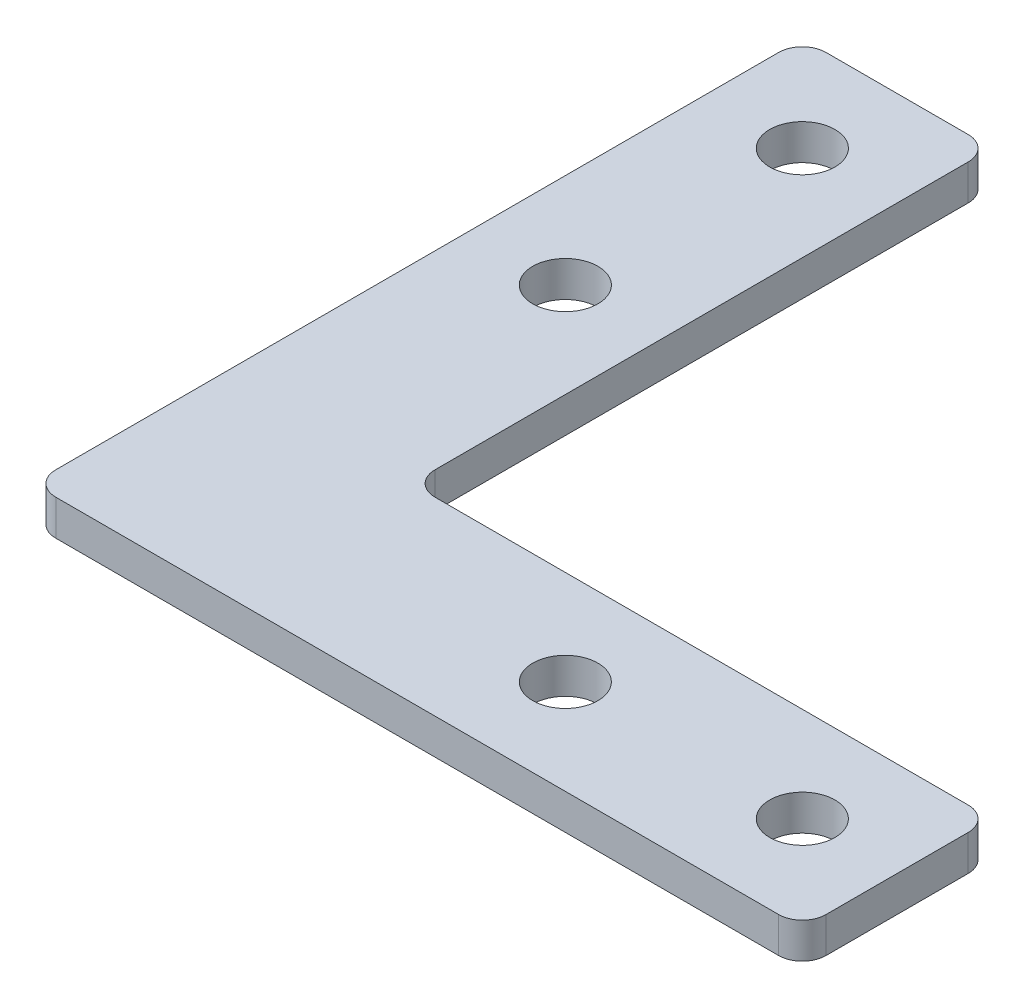
ISO-10303-21;
HEADER;
FILE_DESCRIPTION(('STEP AP214'),'2;1');
FILE_NAME('part.step','',(''),(''),'','','');
FILE_SCHEMA(('AUTOMOTIVE_DESIGN { 1 0 10303 214 1 1 1 1 }'));
ENDSEC;
DATA;
#1=APPLICATION_CONTEXT('core data for automotive mechanical design processes');
#2=APPLICATION_PROTOCOL_DEFINITION('international standard','automotive_design',2000,#1);
#3=PRODUCT_CONTEXT('',#1,'mechanical');
#4=PRODUCT('Part','Part','',(#3));
#5=PRODUCT_RELATED_PRODUCT_CATEGORY('part','',(#4));
#6=PRODUCT_DEFINITION_FORMATION('','',#4);
#7=PRODUCT_DEFINITION_CONTEXT('part definition',#1,'design');
#8=PRODUCT_DEFINITION('design','',#6,#7);
#9=PRODUCT_DEFINITION_SHAPE('','',#8);
#10=(LENGTH_UNIT() NAMED_UNIT(*) SI_UNIT(.MILLI.,.METRE.));
#11=(NAMED_UNIT(*) PLANE_ANGLE_UNIT() SI_UNIT($,.RADIAN.));
#12=(NAMED_UNIT(*) SI_UNIT($,.STERADIAN.) SOLID_ANGLE_UNIT());
#13=UNCERTAINTY_MEASURE_WITH_UNIT(LENGTH_MEASURE(1.E-05),#10,'distance_accuracy_value','');
#14=(GEOMETRIC_REPRESENTATION_CONTEXT(3) GLOBAL_UNCERTAINTY_ASSIGNED_CONTEXT((#13)) GLOBAL_UNIT_ASSIGNED_CONTEXT((#10,
#11,#12)) REPRESENTATION_CONTEXT('',''));
#15=CARTESIAN_POINT('',(0.,0.,0.));
#16=DIRECTION('',(0.,0.,1.));
#17=DIRECTION('',(1.,0.,0.));
#18=AXIS2_PLACEMENT_3D('',#15,#16,#17);
#19=CARTESIAN_POINT('',(-34.3186376674026,3.,20.5779741957317));
#20=DIRECTION('',(0.,1.,0.));
#21=DIRECTION('',(0.,0.,1.));
#22=AXIS2_PLACEMENT_3D('',#19,#20,#21);
#23=PLANE('',#22);
#24=CARTESIAN_POINT('',(-28.3186376674026,3.,-34.4220258042683));
#25=DIRECTION('',(0.,1.,0.));
#26=DIRECTION('',(0.,0.,-1.));
#27=AXIS2_PLACEMENT_3D('',#24,#25,#26);
#28=CIRCLE('',#27,2.74999999999999);
#29=CARTESIAN_POINT('',(-28.3186376674026,3.,-37.1720258042683));
#30=VERTEX_POINT('',#29);
#31=EDGE_CURVE('E338',#30,#30,#28,.T.);
#32=ORIENTED_EDGE('',*,*,#31,.F.);
#33=EDGE_LOOP('',(#32));
#34=FACE_BOUND('',#33,.T.);
#35=CARTESIAN_POINT('',(20.6813623325974,3.,14.5779741957317));
#36=DIRECTION('',(0.,1.,0.));
#37=DIRECTION('',(0.,0.,1.));
#38=AXIS2_PLACEMENT_3D('',#35,#36,#37);
#39=CIRCLE('',#38,2.75);
#40=CARTESIAN_POINT('',(20.6813623325974,3.,17.3279741957317));
#41=VERTEX_POINT('',#40);
#42=EDGE_CURVE('E176',#41,#41,#39,.T.);
#43=ORIENTED_EDGE('',*,*,#42,.F.);
#44=EDGE_LOOP('',(#43));
#45=FACE_BOUND('',#44,.T.);
#46=CARTESIAN_POINT('',(-34.3186376674026,3.,20.5779741957317));
#47=DIRECTION('',(0.,1.,0.));
#48=DIRECTION('',(0.,0.,1.));
#49=AXIS2_PLACEMENT_3D('',#46,#47,#48);
#50=CIRCLE('',#49,2.);
#51=CARTESIAN_POINT('',(-36.3186376674026,3.,20.5779741957316));
#52=VERTEX_POINT('',#51);
#53=CARTESIAN_POINT('',(-34.3186376674026,3.,22.5779741957317));
#54=VERTEX_POINT('',#53);
#55=EDGE_CURVE('E206',#52,#54,#50,.T.);
#56=ORIENTED_EDGE('',*,*,#55,.T.);
#57=DIRECTION('',(1.,0.,0.));
#58=VECTOR('',#57,1.);
#59=CARTESIAN_POINT('',(-34.3186376674026,3.,22.5779741957317));
#60=LINE('',#59,#58);
#61=CARTESIAN_POINT('',(26.6813623325974,3.,22.5779741957317));
#62=VERTEX_POINT('',#61);
#63=EDGE_CURVE('E118',#54,#62,#60,.T.);
#64=ORIENTED_EDGE('',*,*,#63,.T.);
#65=CARTESIAN_POINT('',(26.6813623325974,3.,20.5779741957317));
#66=DIRECTION('',(0.,1.,0.));
#67=DIRECTION('',(0.,0.,1.));
#68=AXIS2_PLACEMENT_3D('',#65,#66,#67);
#69=CIRCLE('',#68,2.);
#70=CARTESIAN_POINT('',(28.6813623325974,3.,20.5779741957317));
#71=VERTEX_POINT('',#70);
#72=EDGE_CURVE('E243',#62,#71,#69,.T.);
#73=ORIENTED_EDGE('',*,*,#72,.T.);
#74=DIRECTION('',(0.,0.,-1.));
#75=VECTOR('',#74,1.);
#76=CARTESIAN_POINT('',(28.6813623325974,3.,20.5779741957317));
#77=LINE('',#76,#75);
#78=CARTESIAN_POINT('',(28.6813623325974,3.,8.57797419573168));
#79=VERTEX_POINT('',#78);
#80=EDGE_CURVE('E263',#71,#79,#77,.T.);
#81=ORIENTED_EDGE('',*,*,#80,.T.);
#82=CARTESIAN_POINT('',(26.6813623325974,3.,8.57797419573167));
#83=DIRECTION('',(0.,1.,0.));
#84=DIRECTION('',(0.,0.,1.));
#85=AXIS2_PLACEMENT_3D('',#82,#83,#84);
#86=CIRCLE('',#85,2.);
#87=CARTESIAN_POINT('',(26.6813623325974,3.,6.57797419573167));
#88=VERTEX_POINT('',#87);
#89=EDGE_CURVE('E259',#79,#88,#86,.T.);
#90=ORIENTED_EDGE('',*,*,#89,.T.);
#91=DIRECTION('',(-1.,0.,0.));
#92=VECTOR('',#91,1.);
#93=CARTESIAN_POINT('',(26.6813623325974,3.,6.57797419573167));
#94=LINE('',#93,#92);
#95=CARTESIAN_POINT('',(-18.3186376674026,3.,6.57797419573167));
#96=VERTEX_POINT('',#95);
#97=EDGE_CURVE('E262',#88,#96,#94,.T.);
#98=ORIENTED_EDGE('',*,*,#97,.T.);
#99=CARTESIAN_POINT('',(-18.3186376674026,3.,4.57797419573167));
#100=DIRECTION('',(0.,-1.,0.));
#101=DIRECTION('',(0.,0.,-1.));
#102=AXIS2_PLACEMENT_3D('',#99,#100,#101);
#103=CIRCLE('',#102,2.);
#104=CARTESIAN_POINT('',(-20.3186376674026,3.,4.57797419573166));
#105=VERTEX_POINT('',#104);
#106=EDGE_CURVE('E267',#96,#105,#103,.T.);
#107=ORIENTED_EDGE('',*,*,#106,.T.);
#108=DIRECTION('',(0.,0.,-1.));
#109=VECTOR('',#108,1.);
#110=CARTESIAN_POINT('',(-20.3186376674026,3.,4.57797419573166));
#111=LINE('',#110,#109);
#112=CARTESIAN_POINT('',(-20.3186376674026,3.,-40.4220258042683));
#113=VERTEX_POINT('',#112);
#114=EDGE_CURVE('E274',#105,#113,#111,.T.);
#115=ORIENTED_EDGE('',*,*,#114,.T.);
#116=CARTESIAN_POINT('',(-22.3186376674026,3.,-40.4220258042683));
#117=DIRECTION('',(0.,1.,0.));
#118=DIRECTION('',(0.,0.,1.));
#119=AXIS2_PLACEMENT_3D('',#116,#117,#118);
#120=CIRCLE('',#119,2.);
#121=CARTESIAN_POINT('',(-22.3186376674027,3.,-42.4220258042683));
#122=VERTEX_POINT('',#121);
#123=EDGE_CURVE('E149',#113,#122,#120,.T.);
#124=ORIENTED_EDGE('',*,*,#123,.T.);
#125=DIRECTION('',(-1.,0.,0.));
#126=VECTOR('',#125,1.);
#127=CARTESIAN_POINT('',(-22.3186376674027,3.,-42.4220258042683));
#128=LINE('',#127,#126);
#129=CARTESIAN_POINT('',(-34.3186376674026,3.,-42.4220258042683));
#130=VERTEX_POINT('',#129);
#131=EDGE_CURVE('E143',#122,#130,#128,.T.);
#132=ORIENTED_EDGE('',*,*,#131,.T.);
#133=CARTESIAN_POINT('',(-34.3186376674026,3.,-40.4220258042683));
#134=DIRECTION('',(0.,1.,0.));
#135=DIRECTION('',(0.,0.,-1.));
#136=AXIS2_PLACEMENT_3D('',#133,#134,#135);
#137=CIRCLE('',#136,2.);
#138=CARTESIAN_POINT('',(-36.3186376674026,3.,-40.4220258042683));
#139=VERTEX_POINT('',#138);
#140=EDGE_CURVE('E147',#130,#139,#137,.T.);
#141=ORIENTED_EDGE('',*,*,#140,.T.);
#142=DIRECTION('',(0.,0.,1.));
#143=VECTOR('',#142,1.);
#144=CARTESIAN_POINT('',(-36.3186376674026,3.,-40.4220258042683));
#145=LINE('',#144,#143);
#146=EDGE_CURVE('E63',#139,#52,#145,.T.);
#147=ORIENTED_EDGE('',*,*,#146,.T.);
#148=EDGE_LOOP('',(#56,#64,#73,#81,#90,#98,#107,#115,#124,#132,#141,#147));
#149=FACE_BOUND('',#148,.T.);
#150=CARTESIAN_POINT('',(0.681362332597368,3.,14.5779741957317));
#151=DIRECTION('',(0.,1.,0.));
#152=DIRECTION('',(0.,0.,1.));
#153=AXIS2_PLACEMENT_3D('',#150,#151,#152);
#154=CIRCLE('',#153,2.75);
#155=CARTESIAN_POINT('',(0.681362332597368,3.,17.3279741957317));
#156=VERTEX_POINT('',#155);
#157=EDGE_CURVE('E346',#156,#156,#154,.T.);
#158=ORIENTED_EDGE('',*,*,#157,.F.);
#159=EDGE_LOOP('',(#158));
#160=FACE_BOUND('',#159,.T.);
#161=CARTESIAN_POINT('',(-28.3186376674026,3.,-14.4220258042683));
#162=DIRECTION('',(0.,1.,0.));
#163=DIRECTION('',(0.,0.,-1.));
#164=AXIS2_PLACEMENT_3D('',#161,#162,#163);
#165=CIRCLE('',#164,2.75);
#166=CARTESIAN_POINT('',(-28.3186376674026,3.,-17.1720258042683));
#167=VERTEX_POINT('',#166);
#168=EDGE_CURVE('E327',#167,#167,#165,.T.);
#169=ORIENTED_EDGE('',*,*,#168,.F.);
#170=EDGE_LOOP('',(#169));
#171=FACE_BOUND('',#170,.T.);
#172=ADVANCED_FACE('F45',(#34,#45,#149,#160,#171),#23,.T.);
#173=CARTESIAN_POINT('',(-34.3186376674026,0.,20.5779741957317));
#174=DIRECTION('',(0.,1.,0.));
#175=DIRECTION('',(0.,0.,1.));
#176=AXIS2_PLACEMENT_3D('',#173,#174,#175);
#177=PLANE('',#176);
#178=CARTESIAN_POINT('',(-34.3186376674026,0.,20.5779741957317));
#179=DIRECTION('',(0.,1.,0.));
#180=DIRECTION('',(0.,0.,1.));
#181=AXIS2_PLACEMENT_3D('',#178,#179,#180);
#182=CIRCLE('',#181,2.);
#183=CARTESIAN_POINT('',(-36.3186376674026,0.,20.5779741957316));
#184=VERTEX_POINT('',#183);
#185=CARTESIAN_POINT('',(-34.3186376674026,0.,22.5779741957317));
#186=VERTEX_POINT('',#185);
#187=EDGE_CURVE('E171',#184,#186,#182,.T.);
#188=ORIENTED_EDGE('',*,*,#187,.F.);
#189=DIRECTION('',(0.,0.,1.));
#190=VECTOR('',#189,1.);
#191=CARTESIAN_POINT('',(-36.3186376674026,0.,-40.4220258042683));
#192=LINE('',#191,#190);
#193=CARTESIAN_POINT('',(-36.3186376674026,0.,-40.4220258042683));
#194=VERTEX_POINT('',#193);
#195=EDGE_CURVE('E110',#194,#184,#192,.T.);
#196=ORIENTED_EDGE('',*,*,#195,.F.);
#197=CARTESIAN_POINT('',(-34.3186376674026,0.,-40.4220258042683));
#198=DIRECTION('',(0.,1.,0.));
#199=DIRECTION('',(0.,0.,-1.));
#200=AXIS2_PLACEMENT_3D('',#197,#198,#199);
#201=CIRCLE('',#200,2.);
#202=CARTESIAN_POINT('',(-34.3186376674026,0.,-42.4220258042683));
#203=VERTEX_POINT('',#202);
#204=EDGE_CURVE('E104',#203,#194,#201,.T.);
#205=ORIENTED_EDGE('',*,*,#204,.F.);
#206=DIRECTION('',(-1.,0.,0.));
#207=VECTOR('',#206,1.);
#208=CARTESIAN_POINT('',(-22.3186376674027,0.,-42.4220258042683));
#209=LINE('',#208,#207);
#210=CARTESIAN_POINT('',(-22.3186376674027,0.,-42.4220258042683));
#211=VERTEX_POINT('',#210);
#212=EDGE_CURVE('E158',#211,#203,#209,.T.);
#213=ORIENTED_EDGE('',*,*,#212,.F.);
#214=CARTESIAN_POINT('',(-22.3186376674026,0.,-40.4220258042683));
#215=DIRECTION('',(0.,1.,0.));
#216=DIRECTION('',(0.,0.,1.));
#217=AXIS2_PLACEMENT_3D('',#214,#215,#216);
#218=CIRCLE('',#217,2.);
#219=CARTESIAN_POINT('',(-20.3186376674026,0.,-40.4220258042683));
#220=VERTEX_POINT('',#219);
#221=EDGE_CURVE('E197',#220,#211,#218,.T.);
#222=ORIENTED_EDGE('',*,*,#221,.F.);
#223=DIRECTION('',(0.,0.,-1.));
#224=VECTOR('',#223,1.);
#225=CARTESIAN_POINT('',(-20.3186376674026,0.,4.57797419573166));
#226=LINE('',#225,#224);
#227=CARTESIAN_POINT('',(-20.3186376674026,0.,4.57797419573166));
#228=VERTEX_POINT('',#227);
#229=EDGE_CURVE('E194',#228,#220,#226,.T.);
#230=ORIENTED_EDGE('',*,*,#229,.F.);
#231=CARTESIAN_POINT('',(-18.3186376674026,0.,4.57797419573167));
#232=DIRECTION('',(0.,-1.,0.));
#233=DIRECTION('',(0.,0.,-1.));
#234=AXIS2_PLACEMENT_3D('',#231,#232,#233);
#235=CIRCLE('',#234,2.);
#236=CARTESIAN_POINT('',(-18.3186376674026,0.,6.57797419573167));
#237=VERTEX_POINT('',#236);
#238=EDGE_CURVE('E191',#237,#228,#235,.T.);
#239=ORIENTED_EDGE('',*,*,#238,.F.);
#240=DIRECTION('',(-1.,0.,0.));
#241=VECTOR('',#240,1.);
#242=CARTESIAN_POINT('',(26.6813623325974,0.,6.57797419573167));
#243=LINE('',#242,#241);
#244=CARTESIAN_POINT('',(26.6813623325974,0.,6.57797419573167));
#245=VERTEX_POINT('',#244);
#246=EDGE_CURVE('E188',#245,#237,#243,.T.);
#247=ORIENTED_EDGE('',*,*,#246,.F.);
#248=CARTESIAN_POINT('',(26.6813623325974,0.,8.57797419573167));
#249=DIRECTION('',(0.,1.,0.));
#250=DIRECTION('',(0.,0.,1.));
#251=AXIS2_PLACEMENT_3D('',#248,#249,#250);
#252=CIRCLE('',#251,2.);
#253=CARTESIAN_POINT('',(28.6813623325974,0.,8.57797419573168));
#254=VERTEX_POINT('',#253);
#255=EDGE_CURVE('E185',#254,#245,#252,.T.);
#256=ORIENTED_EDGE('',*,*,#255,.F.);
#257=DIRECTION('',(0.,0.,-1.));
#258=VECTOR('',#257,1.);
#259=CARTESIAN_POINT('',(28.6813623325974,0.,20.5779741957317));
#260=LINE('',#259,#258);
#261=CARTESIAN_POINT('',(28.6813623325974,0.,20.5779741957317));
#262=VERTEX_POINT('',#261);
#263=EDGE_CURVE('E182',#262,#254,#260,.T.);
#264=ORIENTED_EDGE('',*,*,#263,.F.);
#265=CARTESIAN_POINT('',(26.6813623325974,0.,20.5779741957317));
#266=DIRECTION('',(0.,1.,0.));
#267=DIRECTION('',(0.,0.,1.));
#268=AXIS2_PLACEMENT_3D('',#265,#266,#267);
#269=CIRCLE('',#268,2.);
#270=CARTESIAN_POINT('',(26.6813623325974,0.,22.5779741957317));
#271=VERTEX_POINT('',#270);
#272=EDGE_CURVE('E179',#271,#262,#269,.T.);
#273=ORIENTED_EDGE('',*,*,#272,.F.);
#274=DIRECTION('',(1.,0.,0.));
#275=VECTOR('',#274,1.);
#276=CARTESIAN_POINT('',(-34.3186376674026,0.,22.5779741957317));
#277=LINE('',#276,#275);
#278=EDGE_CURVE('E175',#186,#271,#277,.T.);
#279=ORIENTED_EDGE('',*,*,#278,.F.);
#280=EDGE_LOOP('',(#188,#196,#205,#213,#222,#230,#239,#247,#256,#264,#273,#279));
#281=FACE_BOUND('',#280,.T.);
#282=CARTESIAN_POINT('',(20.6813623325974,0.,14.5779741957317));
#283=DIRECTION('',(0.,1.,0.));
#284=DIRECTION('',(0.,0.,1.));
#285=AXIS2_PLACEMENT_3D('',#282,#283,#284);
#286=CIRCLE('',#285,2.75);
#287=CARTESIAN_POINT('',(20.6813623325974,0.,17.3279741957317));
#288=VERTEX_POINT('',#287);
#289=EDGE_CURVE('E350',#288,#288,#286,.T.);
#290=ORIENTED_EDGE('',*,*,#289,.T.);
#291=EDGE_LOOP('',(#290));
#292=FACE_BOUND('',#291,.T.);
#293=CARTESIAN_POINT('',(0.681362332597368,0.,14.5779741957317));
#294=DIRECTION('',(0.,1.,0.));
#295=DIRECTION('',(0.,0.,1.));
#296=AXIS2_PLACEMENT_3D('',#293,#294,#295);
#297=CIRCLE('',#296,2.75);
#298=CARTESIAN_POINT('',(0.681362332597368,0.,17.3279741957317));
#299=VERTEX_POINT('',#298);
#300=EDGE_CURVE('E342',#299,#299,#297,.T.);
#301=ORIENTED_EDGE('',*,*,#300,.T.);
#302=EDGE_LOOP('',(#301));
#303=FACE_BOUND('',#302,.T.);
#304=CARTESIAN_POINT('',(-28.3186376674026,0.,-34.4220258042683));
#305=DIRECTION('',(0.,1.,0.));
#306=DIRECTION('',(0.,0.,-1.));
#307=AXIS2_PLACEMENT_3D('',#304,#305,#306);
#308=CIRCLE('',#307,2.74999999999999);
#309=CARTESIAN_POINT('',(-28.3186376674026,0.,-37.1720258042683));
#310=VERTEX_POINT('',#309);
#311=EDGE_CURVE('E335',#310,#310,#308,.T.);
#312=ORIENTED_EDGE('',*,*,#311,.T.);
#313=EDGE_LOOP('',(#312));
#314=FACE_BOUND('',#313,.T.);
#315=CARTESIAN_POINT('',(-28.3186376674026,0.,-14.4220258042683));
#316=DIRECTION('',(0.,1.,0.));
#317=DIRECTION('',(0.,0.,-1.));
#318=AXIS2_PLACEMENT_3D('',#315,#316,#317);
#319=CIRCLE('',#318,2.75);
#320=CARTESIAN_POINT('',(-28.3186376674026,0.,-17.1720258042683));
#321=VERTEX_POINT('',#320);
#322=EDGE_CURVE('E330',#321,#321,#319,.T.);
#323=ORIENTED_EDGE('',*,*,#322,.T.);
#324=EDGE_LOOP('',(#323));
#325=FACE_BOUND('',#324,.T.);
#326=ADVANCED_FACE('F247',(#281,#292,#303,#314,#325),#177,.F.);
#327=CARTESIAN_POINT('',(-34.3186376674026,3.,20.5779741957317));
#328=DIRECTION('',(0.,-1.,0.));
#329=DIRECTION('',(0.,0.,-1.));
#330=AXIS2_PLACEMENT_3D('',#327,#328,#329);
#331=CYLINDRICAL_SURFACE('',#330,2.);
#332=ORIENTED_EDGE('',*,*,#187,.T.);
#333=DIRECTION('',(0.,-1.,0.));
#334=VECTOR('',#333,1.);
#335=CARTESIAN_POINT('',(-34.3186376674026,3.,22.5779741957317));
#336=LINE('',#335,#334);
#337=EDGE_CURVE('E11',#54,#186,#336,.T.);
#338=ORIENTED_EDGE('',*,*,#337,.F.);
#339=ORIENTED_EDGE('',*,*,#55,.F.);
#340=DIRECTION('',(0.,-1.,0.));
#341=VECTOR('',#340,1.);
#342=CARTESIAN_POINT('',(-36.3186376674026,3.,20.5779741957316));
#343=LINE('',#342,#341);
#344=EDGE_CURVE('E167',#52,#184,#343,.T.);
#345=ORIENTED_EDGE('',*,*,#344,.T.);
#346=EDGE_LOOP('',(#332,#338,#339,#345));
#347=FACE_BOUND('',#346,.T.);
#348=ADVANCED_FACE('F47',(#347),#331,.T.);
#349=CARTESIAN_POINT('',(-34.3186376674026,3.,22.5779741957317));
#350=DIRECTION('',(0.,0.,-1.));
#351=DIRECTION('',(-1.,0.,0.));
#352=AXIS2_PLACEMENT_3D('',#349,#350,#351);
#353=PLANE('',#352);
#354=ORIENTED_EDGE('',*,*,#278,.T.);
#355=DIRECTION('',(0.,-1.,0.));
#356=VECTOR('',#355,1.);
#357=CARTESIAN_POINT('',(26.6813623325974,3.,22.5779741957317));
#358=LINE('',#357,#356);
#359=EDGE_CURVE('E55',#62,#271,#358,.T.);
#360=ORIENTED_EDGE('',*,*,#359,.F.);
#361=ORIENTED_EDGE('',*,*,#63,.F.);
#362=ORIENTED_EDGE('',*,*,#337,.T.);
#363=EDGE_LOOP('',(#354,#360,#361,#362));
#364=FACE_BOUND('',#363,.T.);
#365=ADVANCED_FACE('F470',(#364),#353,.F.);
#366=CARTESIAN_POINT('',(26.6813623325974,3.,20.5779741957317));
#367=DIRECTION('',(0.,-1.,0.));
#368=DIRECTION('',(0.,0.,-1.));
#369=AXIS2_PLACEMENT_3D('',#366,#367,#368);
#370=CYLINDRICAL_SURFACE('',#369,2.);
#371=ORIENTED_EDGE('',*,*,#272,.T.);
#372=DIRECTION('',(0.,-1.,0.));
#373=VECTOR('',#372,1.);
#374=CARTESIAN_POINT('',(28.6813623325974,3.,20.5779741957317));
#375=LINE('',#374,#373);
#376=EDGE_CURVE('E233',#71,#262,#375,.T.);
#377=ORIENTED_EDGE('',*,*,#376,.F.);
#378=ORIENTED_EDGE('',*,*,#72,.F.);
#379=ORIENTED_EDGE('',*,*,#359,.T.);
#380=EDGE_LOOP('',(#371,#377,#378,#379));
#381=FACE_BOUND('',#380,.T.);
#382=ADVANCED_FACE('F241',(#381),#370,.T.);
#383=CARTESIAN_POINT('',(28.6813623325974,3.,20.5779741957317));
#384=DIRECTION('',(-1.,0.,0.));
#385=DIRECTION('',(0.,0.,1.));
#386=AXIS2_PLACEMENT_3D('',#383,#384,#385);
#387=PLANE('',#386);
#388=ORIENTED_EDGE('',*,*,#263,.T.);
#389=DIRECTION('',(0.,-1.,0.));
#390=VECTOR('',#389,1.);
#391=CARTESIAN_POINT('',(28.6813623325974,3.,8.57797419573168));
#392=LINE('',#391,#390);
#393=EDGE_CURVE('E229',#79,#254,#392,.T.);
#394=ORIENTED_EDGE('',*,*,#393,.F.);
#395=ORIENTED_EDGE('',*,*,#80,.F.);
#396=ORIENTED_EDGE('',*,*,#376,.T.);
#397=EDGE_LOOP('',(#388,#394,#395,#396));
#398=FACE_BOUND('',#397,.T.);
#399=ADVANCED_FACE('F253',(#398),#387,.F.);
#400=CARTESIAN_POINT('',(26.6813623325974,3.,8.57797419573167));
#401=DIRECTION('',(0.,-1.,0.));
#402=DIRECTION('',(0.,0.,-1.));
#403=AXIS2_PLACEMENT_3D('',#400,#401,#402);
#404=CYLINDRICAL_SURFACE('',#403,2.);
#405=ORIENTED_EDGE('',*,*,#255,.T.);
#406=DIRECTION('',(0.,-1.,0.));
#407=VECTOR('',#406,1.);
#408=CARTESIAN_POINT('',(26.6813623325974,3.,6.57797419573167));
#409=LINE('',#408,#407);
#410=EDGE_CURVE('E225',#88,#245,#409,.T.);
#411=ORIENTED_EDGE('',*,*,#410,.F.);
#412=ORIENTED_EDGE('',*,*,#89,.F.);
#413=ORIENTED_EDGE('',*,*,#393,.T.);
#414=EDGE_LOOP('',(#405,#411,#412,#413));
#415=FACE_BOUND('',#414,.T.);
#416=ADVANCED_FACE('F257',(#415),#404,.T.);
#417=CARTESIAN_POINT('',(26.6813623325974,3.,6.57797419573167));
#418=DIRECTION('',(0.,0.,1.));
#419=DIRECTION('',(1.,0.,0.));
#420=AXIS2_PLACEMENT_3D('',#417,#418,#419);
#421=PLANE('',#420);
#422=ORIENTED_EDGE('',*,*,#246,.T.);
#423=DIRECTION('',(0.,-1.,0.));
#424=VECTOR('',#423,1.);
#425=CARTESIAN_POINT('',(-18.3186376674026,3.,6.57797419573167));
#426=LINE('',#425,#424);
#427=EDGE_CURVE('E221',#96,#237,#426,.T.);
#428=ORIENTED_EDGE('',*,*,#427,.F.);
#429=ORIENTED_EDGE('',*,*,#97,.F.);
#430=ORIENTED_EDGE('',*,*,#410,.T.);
#431=EDGE_LOOP('',(#422,#428,#429,#430));
#432=FACE_BOUND('',#431,.T.);
#433=ADVANCED_FACE('F435',(#432),#421,.F.);
#434=CARTESIAN_POINT('',(-18.3186376674026,3.,4.57797419573167));
#435=DIRECTION('',(0.,-1.,0.));
#436=DIRECTION('',(0.,0.,-1.));
#437=AXIS2_PLACEMENT_3D('',#434,#435,#436);
#438=CYLINDRICAL_SURFACE('',#437,2.);
#439=ORIENTED_EDGE('',*,*,#238,.T.);
#440=DIRECTION('',(0.,-1.,0.));
#441=VECTOR('',#440,1.);
#442=CARTESIAN_POINT('',(-20.3186376674026,3.,4.57797419573166));
#443=LINE('',#442,#441);
#444=EDGE_CURVE('E217',#105,#228,#443,.T.);
#445=ORIENTED_EDGE('',*,*,#444,.F.);
#446=ORIENTED_EDGE('',*,*,#106,.F.);
#447=ORIENTED_EDGE('',*,*,#427,.T.);
#448=EDGE_LOOP('',(#439,#445,#446,#447));
#449=FACE_BOUND('',#448,.T.);
#450=ADVANCED_FACE('F426',(#449),#438,.F.);
#451=CARTESIAN_POINT('',(-20.3186376674026,3.,4.57797419573166));
#452=DIRECTION('',(-1.,0.,0.));
#453=DIRECTION('',(0.,0.,1.));
#454=AXIS2_PLACEMENT_3D('',#451,#452,#453);
#455=PLANE('',#454);
#456=ORIENTED_EDGE('',*,*,#229,.T.);
#457=DIRECTION('',(0.,-1.,0.));
#458=VECTOR('',#457,1.);
#459=CARTESIAN_POINT('',(-20.3186376674026,3.,-40.4220258042683));
#460=LINE('',#459,#458);
#461=EDGE_CURVE('E213',#113,#220,#460,.T.);
#462=ORIENTED_EDGE('',*,*,#461,.F.);
#463=ORIENTED_EDGE('',*,*,#114,.F.);
#464=ORIENTED_EDGE('',*,*,#444,.T.);
#465=EDGE_LOOP('',(#456,#462,#463,#464));
#466=FACE_BOUND('',#465,.T.);
#467=ADVANCED_FACE('F282',(#466),#455,.F.);
#468=CARTESIAN_POINT('',(-22.3186376674026,3.,-40.4220258042683));
#469=DIRECTION('',(0.,-1.,0.));
#470=DIRECTION('',(0.,0.,-1.));
#471=AXIS2_PLACEMENT_3D('',#468,#469,#470);
#472=CYLINDRICAL_SURFACE('',#471,2.);
#473=ORIENTED_EDGE('',*,*,#221,.T.);
#474=DIRECTION('',(0.,-1.,0.));
#475=VECTOR('',#474,1.);
#476=CARTESIAN_POINT('',(-22.3186376674027,3.,-42.4220258042683));
#477=LINE('',#476,#475);
#478=EDGE_CURVE('E160',#122,#211,#477,.T.);
#479=ORIENTED_EDGE('',*,*,#478,.F.);
#480=ORIENTED_EDGE('',*,*,#123,.F.);
#481=ORIENTED_EDGE('',*,*,#461,.T.);
#482=EDGE_LOOP('',(#473,#479,#480,#481));
#483=FACE_BOUND('',#482,.T.);
#484=ADVANCED_FACE('F286',(#483),#472,.T.);
#485=CARTESIAN_POINT('',(-22.3186376674027,3.,-42.4220258042683));
#486=DIRECTION('',(0.,0.,1.));
#487=DIRECTION('',(1.,0.,0.));
#488=AXIS2_PLACEMENT_3D('',#485,#486,#487);
#489=PLANE('',#488);
#490=ORIENTED_EDGE('',*,*,#212,.T.);
#491=DIRECTION('',(0.,-1.,0.));
#492=VECTOR('',#491,1.);
#493=CARTESIAN_POINT('',(-34.3186376674026,3.,-42.4220258042683));
#494=LINE('',#493,#492);
#495=EDGE_CURVE('E155',#130,#203,#494,.T.);
#496=ORIENTED_EDGE('',*,*,#495,.F.);
#497=ORIENTED_EDGE('',*,*,#131,.F.);
#498=ORIENTED_EDGE('',*,*,#478,.T.);
#499=EDGE_LOOP('',(#490,#496,#497,#498));
#500=FACE_BOUND('',#499,.T.);
#501=ADVANCED_FACE('F156',(#500),#489,.F.);
#502=CARTESIAN_POINT('',(-34.3186376674026,3.,-40.4220258042683));
#503=DIRECTION('',(0.,-1.,0.));
#504=DIRECTION('',(0.,0.,-1.));
#505=AXIS2_PLACEMENT_3D('',#502,#503,#504);
#506=CYLINDRICAL_SURFACE('',#505,2.);
#507=ORIENTED_EDGE('',*,*,#204,.T.);
#508=DIRECTION('',(0.,-1.,0.));
#509=VECTOR('',#508,1.);
#510=CARTESIAN_POINT('',(-36.3186376674026,3.,-40.4220258042683));
#511=LINE('',#510,#509);
#512=EDGE_CURVE('E161',#139,#194,#511,.T.);
#513=ORIENTED_EDGE('',*,*,#512,.F.);
#514=ORIENTED_EDGE('',*,*,#140,.F.);
#515=ORIENTED_EDGE('',*,*,#495,.T.);
#516=EDGE_LOOP('',(#507,#513,#514,#515));
#517=FACE_BOUND('',#516,.T.);
#518=ADVANCED_FACE('F163',(#517),#506,.T.);
#519=CARTESIAN_POINT('',(-36.3186376674026,3.,-40.4220258042683));
#520=DIRECTION('',(1.,0.,0.));
#521=DIRECTION('',(0.,0.,-1.));
#522=AXIS2_PLACEMENT_3D('',#519,#520,#521);
#523=PLANE('',#522);
#524=ORIENTED_EDGE('',*,*,#195,.T.);
#525=ORIENTED_EDGE('',*,*,#344,.F.);
#526=ORIENTED_EDGE('',*,*,#146,.F.);
#527=ORIENTED_EDGE('',*,*,#512,.T.);
#528=EDGE_LOOP('',(#524,#525,#526,#527));
#529=FACE_BOUND('',#528,.T.);
#530=ADVANCED_FACE('F290',(#529),#523,.F.);
#531=CARTESIAN_POINT('',(20.6813623325974,3.,14.5779741957317));
#532=DIRECTION('',(0.,-1.,0.));
#533=DIRECTION('',(0.,0.,-1.));
#534=AXIS2_PLACEMENT_3D('',#531,#532,#533);
#535=CYLINDRICAL_SURFACE('',#534,2.75);
#536=ORIENTED_EDGE('',*,*,#42,.T.);
#537=EDGE_LOOP('',(#536));
#538=FACE_BOUND('',#537,.T.);
#539=ORIENTED_EDGE('',*,*,#289,.F.);
#540=EDGE_LOOP('',(#539));
#541=FACE_BOUND('',#540,.T.);
#542=ADVANCED_FACE('F292',(#538,#541),#535,.F.);
#543=CARTESIAN_POINT('',(0.681362332597368,3.,14.5779741957317));
#544=DIRECTION('',(0.,-1.,0.));
#545=DIRECTION('',(0.,0.,-1.));
#546=AXIS2_PLACEMENT_3D('',#543,#544,#545);
#547=CYLINDRICAL_SURFACE('',#546,2.75);
#548=ORIENTED_EDGE('',*,*,#157,.T.);
#549=EDGE_LOOP('',(#548));
#550=FACE_BOUND('',#549,.T.);
#551=ORIENTED_EDGE('',*,*,#300,.F.);
#552=EDGE_LOOP('',(#551));
#553=FACE_BOUND('',#552,.T.);
#554=ADVANCED_FACE('F298',(#550,#553),#547,.F.);
#555=CARTESIAN_POINT('',(-28.3186376674026,3.,-34.4220258042683));
#556=DIRECTION('',(0.,-1.,0.));
#557=DIRECTION('',(0.,0.,-1.));
#558=AXIS2_PLACEMENT_3D('',#555,#556,#557);
#559=CYLINDRICAL_SURFACE('',#558,2.74999999999999);
#560=ORIENTED_EDGE('',*,*,#31,.T.);
#561=EDGE_LOOP('',(#560));
#562=FACE_BOUND('',#561,.T.);
#563=ORIENTED_EDGE('',*,*,#311,.F.);
#564=EDGE_LOOP('',(#563));
#565=FACE_BOUND('',#564,.T.);
#566=ADVANCED_FACE('F314',(#562,#565),#559,.F.);
#567=CARTESIAN_POINT('',(-28.3186376674026,3.,-14.4220258042683));
#568=DIRECTION('',(0.,-1.,0.));
#569=DIRECTION('',(0.,0.,-1.));
#570=AXIS2_PLACEMENT_3D('',#567,#568,#569);
#571=CYLINDRICAL_SURFACE('',#570,2.75);
#572=ORIENTED_EDGE('',*,*,#168,.T.);
#573=EDGE_LOOP('',(#572));
#574=FACE_BOUND('',#573,.T.);
#575=ORIENTED_EDGE('',*,*,#322,.F.);
#576=EDGE_LOOP('',(#575));
#577=FACE_BOUND('',#576,.T.);
#578=ADVANCED_FACE('F318',(#574,#577),#571,.F.);
#579=CLOSED_SHELL('',(#172,#326,#348,#365,#382,#399,#416,#433,#450,#467,#484,#501,#518,#530,
#542,#554,#566,#578));
#580=MANIFOLD_SOLID_BREP('B2',#579);
#581=ADVANCED_BREP_SHAPE_REPRESENTATION('',(#18,#580),#14);
#582=SHAPE_DEFINITION_REPRESENTATION(#9,#581);
ENDSEC;
END-ISO-10303-21;
